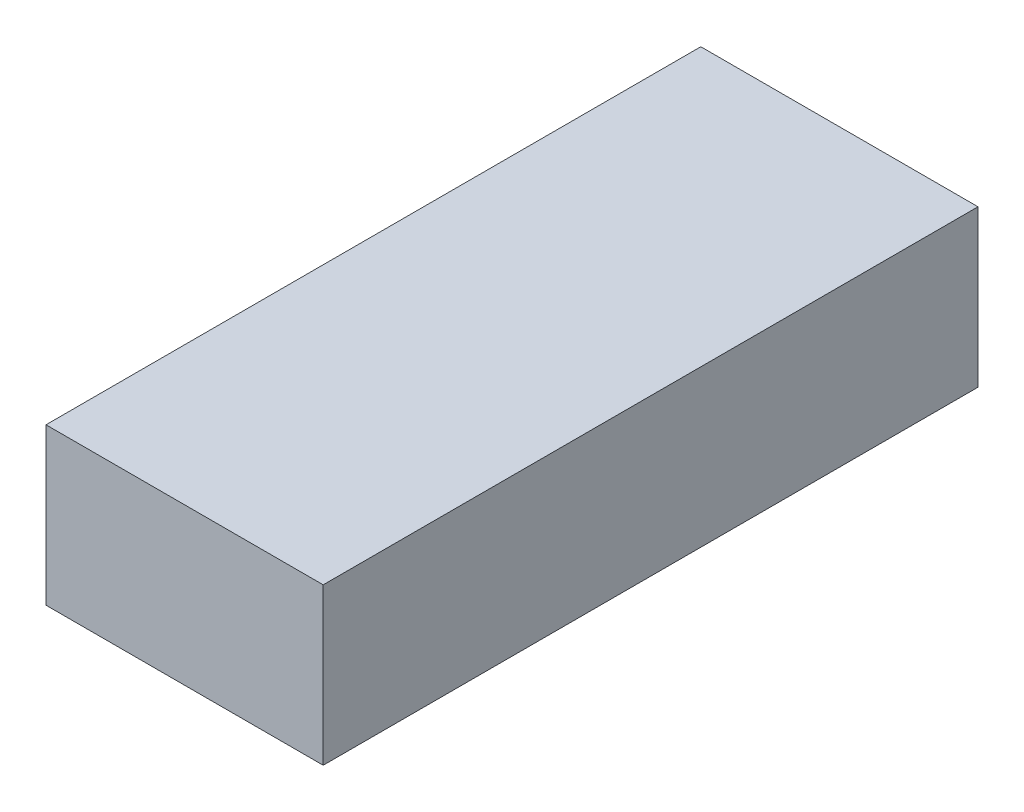
ISO-10303-21;
HEADER;
FILE_DESCRIPTION(('STEP AP214'),'2;1');
FILE_NAME('part.step','',(''),(''),'','','');
FILE_SCHEMA(('AUTOMOTIVE_DESIGN { 1 0 10303 214 1 1 1 1 }'));
ENDSEC;
DATA;
#1=APPLICATION_CONTEXT('core data for automotive mechanical design processes');
#2=APPLICATION_PROTOCOL_DEFINITION('international standard','automotive_design',2000,#1);
#3=PRODUCT_CONTEXT('',#1,'mechanical');
#4=PRODUCT('Part','Part','',(#3));
#5=PRODUCT_RELATED_PRODUCT_CATEGORY('part','',(#4));
#6=PRODUCT_DEFINITION_FORMATION('','',#4);
#7=PRODUCT_DEFINITION_CONTEXT('part definition',#1,'design');
#8=PRODUCT_DEFINITION('design','',#6,#7);
#9=PRODUCT_DEFINITION_SHAPE('','',#8);
#10=(LENGTH_UNIT() NAMED_UNIT(*) SI_UNIT(.MILLI.,.METRE.));
#11=(NAMED_UNIT(*) PLANE_ANGLE_UNIT() SI_UNIT($,.RADIAN.));
#12=(NAMED_UNIT(*) SI_UNIT($,.STERADIAN.) SOLID_ANGLE_UNIT());
#13=UNCERTAINTY_MEASURE_WITH_UNIT(LENGTH_MEASURE(1.E-05),#10,'distance_accuracy_value','');
#14=(GEOMETRIC_REPRESENTATION_CONTEXT(3) GLOBAL_UNCERTAINTY_ASSIGNED_CONTEXT((#13)) GLOBAL_UNIT_ASSIGNED_CONTEXT((#10,
#11,#12)) REPRESENTATION_CONTEXT('',''));
#15=CARTESIAN_POINT('',(0.,0.,0.));
#16=DIRECTION('',(0.,0.,1.));
#17=DIRECTION('',(1.,0.,0.));
#18=AXIS2_PLACEMENT_3D('',#15,#16,#17);
#19=CARTESIAN_POINT('',(-3.175,-1.79,15.));
#20=DIRECTION('',(1.,0.,0.));
#21=DIRECTION('',(0.,0.,-1.));
#22=AXIS2_PLACEMENT_3D('',#19,#20,#21);
#23=PLANE('',#22);
#24=DIRECTION('',(0.,-1.,0.));
#25=VECTOR('',#24,1.);
#26=CARTESIAN_POINT('',(-3.175,-1.79,0.));
#27=LINE('',#26,#25);
#28=CARTESIAN_POINT('',(-3.175,1.79,0.));
#29=VERTEX_POINT('',#28);
#30=CARTESIAN_POINT('',(-3.175,-1.79,0.));
#31=VERTEX_POINT('',#30);
#32=EDGE_CURVE('E96',#29,#31,#27,.T.);
#33=ORIENTED_EDGE('',*,*,#32,.T.);
#34=DIRECTION('',(0.,0.,-1.));
#35=VECTOR('',#34,1.);
#36=CARTESIAN_POINT('',(-3.175,-1.79,15.));
#37=LINE('',#36,#35);
#38=CARTESIAN_POINT('',(-3.175,-1.79,15.));
#39=VERTEX_POINT('',#38);
#40=EDGE_CURVE('E11',#39,#31,#37,.T.);
#41=ORIENTED_EDGE('',*,*,#40,.F.);
#42=DIRECTION('',(0.,-1.,0.));
#43=VECTOR('',#42,1.);
#44=CARTESIAN_POINT('',(-3.175,-1.79,15.));
#45=LINE('',#44,#43);
#46=CARTESIAN_POINT('',(-3.175,1.79,15.));
#47=VERTEX_POINT('',#46);
#48=EDGE_CURVE('E84',#47,#39,#45,.T.);
#49=ORIENTED_EDGE('',*,*,#48,.F.);
#50=DIRECTION('',(0.,0.,-1.));
#51=VECTOR('',#50,1.);
#52=CARTESIAN_POINT('',(-3.175,1.79,15.));
#53=LINE('',#52,#51);
#54=EDGE_CURVE('E92',#47,#29,#53,.T.);
#55=ORIENTED_EDGE('',*,*,#54,.T.);
#56=EDGE_LOOP('',(#33,#41,#49,#55));
#57=FACE_BOUND('',#56,.T.);
#58=ADVANCED_FACE('F33',(#57),#23,.F.);
#59=CARTESIAN_POINT('',(-3.175,-1.79,15.));
#60=DIRECTION('',(0.,1.,0.));
#61=DIRECTION('',(0.,0.,1.));
#62=AXIS2_PLACEMENT_3D('',#59,#60,#61);
#63=PLANE('',#62);
#64=DIRECTION('',(1.,0.,0.));
#65=VECTOR('',#64,1.);
#66=CARTESIAN_POINT('',(-3.175,-1.79,0.));
#67=LINE('',#66,#65);
#68=CARTESIAN_POINT('',(3.175,-1.79,0.));
#69=VERTEX_POINT('',#68);
#70=EDGE_CURVE('E88',#31,#69,#67,.T.);
#71=ORIENTED_EDGE('',*,*,#70,.T.);
#72=DIRECTION('',(0.,0.,-1.));
#73=VECTOR('',#72,1.);
#74=CARTESIAN_POINT('',(3.175,-1.79,15.));
#75=LINE('',#74,#73);
#76=CARTESIAN_POINT('',(3.175,-1.79,15.));
#77=VERTEX_POINT('',#76);
#78=EDGE_CURVE('E41',#77,#69,#75,.T.);
#79=ORIENTED_EDGE('',*,*,#78,.F.);
#80=DIRECTION('',(1.,0.,0.));
#81=VECTOR('',#80,1.);
#82=CARTESIAN_POINT('',(-3.175,-1.79,15.));
#83=LINE('',#82,#81);
#84=EDGE_CURVE('E79',#39,#77,#83,.T.);
#85=ORIENTED_EDGE('',*,*,#84,.F.);
#86=ORIENTED_EDGE('',*,*,#40,.T.);
#87=EDGE_LOOP('',(#71,#79,#85,#86));
#88=FACE_BOUND('',#87,.T.);
#89=ADVANCED_FACE('F87',(#88),#63,.F.);
#90=CARTESIAN_POINT('',(3.175,-1.79,15.));
#91=DIRECTION('',(-1.,0.,0.));
#92=DIRECTION('',(0.,0.,1.));
#93=AXIS2_PLACEMENT_3D('',#90,#91,#92);
#94=PLANE('',#93);
#95=DIRECTION('',(0.,1.,0.));
#96=VECTOR('',#95,1.);
#97=CARTESIAN_POINT('',(3.175,-1.79,0.));
#98=LINE('',#97,#96);
#99=CARTESIAN_POINT('',(3.175,1.79,0.));
#100=VERTEX_POINT('',#99);
#101=EDGE_CURVE('E66',#69,#100,#98,.T.);
#102=ORIENTED_EDGE('',*,*,#101,.T.);
#103=DIRECTION('',(0.,0.,-1.));
#104=VECTOR('',#103,1.);
#105=CARTESIAN_POINT('',(3.175,1.79,15.));
#106=LINE('',#105,#104);
#107=CARTESIAN_POINT('',(3.175,1.79,15.));
#108=VERTEX_POINT('',#107);
#109=EDGE_CURVE('E89',#108,#100,#106,.T.);
#110=ORIENTED_EDGE('',*,*,#109,.F.);
#111=DIRECTION('',(0.,1.,0.));
#112=VECTOR('',#111,1.);
#113=CARTESIAN_POINT('',(3.175,-1.79,15.));
#114=LINE('',#113,#112);
#115=EDGE_CURVE('E82',#77,#108,#114,.T.);
#116=ORIENTED_EDGE('',*,*,#115,.F.);
#117=ORIENTED_EDGE('',*,*,#78,.T.);
#118=EDGE_LOOP('',(#102,#110,#116,#117));
#119=FACE_BOUND('',#118,.T.);
#120=ADVANCED_FACE('F90',(#119),#94,.F.);
#121=CARTESIAN_POINT('',(-3.175,1.79,15.));
#122=DIRECTION('',(0.,-1.,0.));
#123=DIRECTION('',(0.,0.,-1.));
#124=AXIS2_PLACEMENT_3D('',#121,#122,#123);
#125=PLANE('',#124);
#126=DIRECTION('',(-1.,0.,0.));
#127=VECTOR('',#126,1.);
#128=CARTESIAN_POINT('',(-3.175,1.79,0.));
#129=LINE('',#128,#127);
#130=EDGE_CURVE('E72',#100,#29,#129,.T.);
#131=ORIENTED_EDGE('',*,*,#130,.T.);
#132=ORIENTED_EDGE('',*,*,#54,.F.);
#133=DIRECTION('',(-1.,0.,0.));
#134=VECTOR('',#133,1.);
#135=CARTESIAN_POINT('',(-3.175,1.79,15.));
#136=LINE('',#135,#134);
#137=EDGE_CURVE('E49',#108,#47,#136,.T.);
#138=ORIENTED_EDGE('',*,*,#137,.F.);
#139=ORIENTED_EDGE('',*,*,#109,.T.);
#140=EDGE_LOOP('',(#131,#132,#138,#139));
#141=FACE_BOUND('',#140,.T.);
#142=ADVANCED_FACE('F103',(#141),#125,.F.);
#143=CARTESIAN_POINT('',(0.,0.,15.));
#144=DIRECTION('',(0.,0.,-1.));
#145=DIRECTION('',(-1.,0.,0.));
#146=AXIS2_PLACEMENT_3D('',#143,#144,#145);
#147=PLANE('',#146);
#148=ORIENTED_EDGE('',*,*,#48,.T.);
#149=ORIENTED_EDGE('',*,*,#84,.T.);
#150=ORIENTED_EDGE('',*,*,#115,.T.);
#151=ORIENTED_EDGE('',*,*,#137,.T.);
#152=EDGE_LOOP('',(#148,#149,#150,#151));
#153=FACE_BOUND('',#152,.T.);
#154=ADVANCED_FACE('F80',(#153),#147,.F.);
#155=CARTESIAN_POINT('',(0.,0.,0.));
#156=DIRECTION('',(0.,0.,-1.));
#157=DIRECTION('',(-1.,0.,0.));
#158=AXIS2_PLACEMENT_3D('',#155,#156,#157);
#159=PLANE('',#158);
#160=ORIENTED_EDGE('',*,*,#32,.F.);
#161=ORIENTED_EDGE('',*,*,#130,.F.);
#162=ORIENTED_EDGE('',*,*,#101,.F.);
#163=ORIENTED_EDGE('',*,*,#70,.F.);
#164=EDGE_LOOP('',(#160,#161,#162,#163));
#165=FACE_BOUND('',#164,.T.);
#166=ADVANCED_FACE('F106',(#165),#159,.T.);
#167=CLOSED_SHELL('',(#58,#89,#120,#142,#154,#166));
#168=MANIFOLD_SOLID_BREP('B2',#167);
#169=ADVANCED_BREP_SHAPE_REPRESENTATION('',(#18,#168),#14);
#170=SHAPE_DEFINITION_REPRESENTATION(#9,#169);
ENDSEC;
END-ISO-10303-21;
